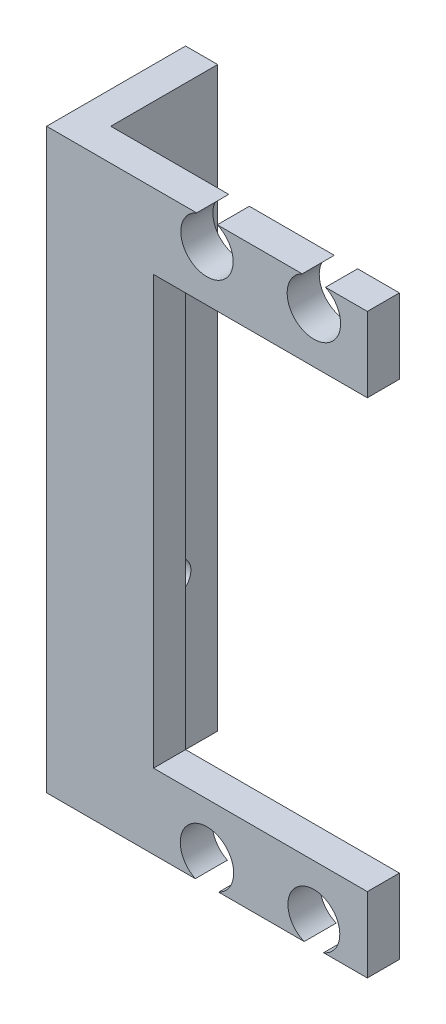
ISO-10303-21;
HEADER;
FILE_DESCRIPTION(('STEP AP214'),'2;1');
FILE_NAME('part.step','',(''),(''),'','','');
FILE_SCHEMA(('AUTOMOTIVE_DESIGN { 1 0 10303 214 1 1 1 1 }'));
ENDSEC;
DATA;
#1=APPLICATION_CONTEXT('core data for automotive mechanical design processes');
#2=APPLICATION_PROTOCOL_DEFINITION('international standard','automotive_design',2000,#1);
#3=PRODUCT_CONTEXT('',#1,'mechanical');
#4=PRODUCT('Part','Part','',(#3));
#5=PRODUCT_RELATED_PRODUCT_CATEGORY('part','',(#4));
#6=PRODUCT_DEFINITION_FORMATION('','',#4);
#7=PRODUCT_DEFINITION_CONTEXT('part definition',#1,'design');
#8=PRODUCT_DEFINITION('design','',#6,#7);
#9=PRODUCT_DEFINITION_SHAPE('','',#8);
#10=(LENGTH_UNIT() NAMED_UNIT(*) SI_UNIT(.MILLI.,.METRE.));
#11=(NAMED_UNIT(*) PLANE_ANGLE_UNIT() SI_UNIT($,.RADIAN.));
#12=(NAMED_UNIT(*) SI_UNIT($,.STERADIAN.) SOLID_ANGLE_UNIT());
#13=UNCERTAINTY_MEASURE_WITH_UNIT(LENGTH_MEASURE(1.E-05),#10,'distance_accuracy_value','');
#14=(GEOMETRIC_REPRESENTATION_CONTEXT(3) GLOBAL_UNCERTAINTY_ASSIGNED_CONTEXT((#13)) GLOBAL_UNIT_ASSIGNED_CONTEXT((#10,
#11,#12)) REPRESENTATION_CONTEXT('',''));
#15=CARTESIAN_POINT('',(0.,0.,0.));
#16=DIRECTION('',(0.,0.,1.));
#17=DIRECTION('',(1.,0.,0.));
#18=AXIS2_PLACEMENT_3D('',#15,#16,#17);
#19=CARTESIAN_POINT('',(3.,0.,13.));
#20=DIRECTION('',(0.,1.,0.));
#21=DIRECTION('',(0.,0.,1.));
#22=AXIS2_PLACEMENT_3D('',#19,#20,#21);
#23=PLANE('',#22);
#24=DIRECTION('',(1.,0.,0.));
#25=VECTOR('',#24,1.);
#26=CARTESIAN_POINT('',(3.,0.,13.));
#27=LINE('',#26,#25);
#28=CARTESIAN_POINT('',(25.9043671376496,0.,13.));
#29=VERTEX_POINT('',#28);
#30=CARTESIAN_POINT('',(30.,0.,13.));
#31=VERTEX_POINT('',#30);
#32=EDGE_CURVE('E202',#29,#31,#27,.T.);
#33=ORIENTED_EDGE('',*,*,#32,.F.);
#34=DIRECTION('',(0.,0.,-1.));
#35=VECTOR('',#34,1.);
#36=CARTESIAN_POINT('',(25.9043671376496,0.,13.));
#37=LINE('',#36,#35);
#38=CARTESIAN_POINT('',(25.9043671376496,0.,9.99999999999999));
#39=VERTEX_POINT('',#38);
#40=EDGE_CURVE('E504',#29,#39,#37,.T.);
#41=ORIENTED_EDGE('',*,*,#40,.T.);
#42=DIRECTION('',(-1.,0.,0.));
#43=VECTOR('',#42,1.);
#44=CARTESIAN_POINT('',(30.,0.,9.99999999999999));
#45=LINE('',#44,#43);
#46=CARTESIAN_POINT('',(30.,0.,9.99999999999999));
#47=VERTEX_POINT('',#46);
#48=EDGE_CURVE('E256',#47,#39,#45,.T.);
#49=ORIENTED_EDGE('',*,*,#48,.F.);
#50=DIRECTION('',(0.,0.,-1.));
#51=VECTOR('',#50,1.);
#52=CARTESIAN_POINT('',(30.,0.,9.99999999999999));
#53=LINE('',#52,#51);
#54=EDGE_CURVE('E545',#31,#47,#53,.T.);
#55=ORIENTED_EDGE('',*,*,#54,.F.);
#56=EDGE_LOOP('',(#33,#41,#49,#55));
#57=FACE_BOUND('',#56,.T.);
#58=ADVANCED_FACE('F41',(#57),#23,.F.);
#59=CARTESIAN_POINT('',(24.0956328623504,0.,9.99999999999999));
#60=VERTEX_POINT('',#59);
#61=CARTESIAN_POINT('',(16.0897247358847,0.,9.99999999999999));
#62=VERTEX_POINT('',#61);
#63=EDGE_CURVE('E247',#60,#62,#45,.T.);
#64=ORIENTED_EDGE('',*,*,#63,.F.);
#65=DIRECTION('',(0.,0.,-1.));
#66=VECTOR('',#65,1.);
#67=CARTESIAN_POINT('',(24.0956328623504,0.,13.));
#68=LINE('',#67,#66);
#69=CARTESIAN_POINT('',(24.0956328623504,0.,13.));
#70=VERTEX_POINT('',#69);
#71=EDGE_CURVE('E502',#60,#70,#68,.F.);
#72=ORIENTED_EDGE('',*,*,#71,.T.);
#73=CARTESIAN_POINT('',(16.0897247358847,0.,13.));
#74=VERTEX_POINT('',#73);
#75=EDGE_CURVE('E201',#74,#70,#27,.T.);
#76=ORIENTED_EDGE('',*,*,#75,.F.);
#77=DIRECTION('',(0.,0.,-1.));
#78=VECTOR('',#77,1.);
#79=CARTESIAN_POINT('',(16.0897247358847,0.,13.));
#80=LINE('',#79,#78);
#81=EDGE_CURVE('E519',#74,#62,#80,.T.);
#82=ORIENTED_EDGE('',*,*,#81,.T.);
#83=EDGE_LOOP('',(#64,#72,#76,#82));
#84=FACE_BOUND('',#83,.T.);
#85=ADVANCED_FACE('F305',(#84),#23,.F.);
#86=CARTESIAN_POINT('',(0.,54.,13.));
#87=DIRECTION('',(0.,-1.,0.));
#88=DIRECTION('',(0.,0.,-1.));
#89=AXIS2_PLACEMENT_3D('',#86,#87,#88);
#90=PLANE('',#89);
#91=DIRECTION('',(-1.,0.,0.));
#92=VECTOR('',#91,1.);
#93=CARTESIAN_POINT('',(0.,54.,13.));
#94=LINE('',#93,#92);
#95=CARTESIAN_POINT('',(14.0365036760482,54.,13.));
#96=VERTEX_POINT('',#95);
#97=CARTESIAN_POINT('',(0.,54.,13.));
#98=VERTEX_POINT('',#97);
#99=EDGE_CURVE('E192',#96,#98,#94,.T.);
#100=ORIENTED_EDGE('',*,*,#99,.F.);
#101=DIRECTION('',(0.,0.,-1.));
#102=VECTOR('',#101,1.);
#103=CARTESIAN_POINT('',(14.0365036760482,54.,13.));
#104=LINE('',#103,#102);
#105=CARTESIAN_POINT('',(14.0365036760482,54.,10.));
#106=VERTEX_POINT('',#105);
#107=EDGE_CURVE('E508',#96,#106,#104,.T.);
#108=ORIENTED_EDGE('',*,*,#107,.T.);
#109=DIRECTION('',(-1.,0.,0.));
#110=VECTOR('',#109,1.);
#111=CARTESIAN_POINT('',(30.,54.,10.));
#112=LINE('',#111,#110);
#113=CARTESIAN_POINT('',(3.,54.,10.));
#114=VERTEX_POINT('',#113);
#115=EDGE_CURVE('E259',#106,#114,#112,.T.);
#116=ORIENTED_EDGE('',*,*,#115,.T.);
#117=DIRECTION('',(0.,0.,-1.));
#118=VECTOR('',#117,1.);
#119=CARTESIAN_POINT('',(3.,54.,13.));
#120=LINE('',#119,#118);
#121=CARTESIAN_POINT('',(3.,54.,0.));
#122=VERTEX_POINT('',#121);
#123=EDGE_CURVE('E225',#114,#122,#120,.T.);
#124=ORIENTED_EDGE('',*,*,#123,.T.);
#125=DIRECTION('',(-1.,0.,0.));
#126=VECTOR('',#125,1.);
#127=CARTESIAN_POINT('',(0.,54.,0.));
#128=LINE('',#127,#126);
#129=CARTESIAN_POINT('',(0.,54.,0.));
#130=VERTEX_POINT('',#129);
#131=EDGE_CURVE('E211',#122,#130,#128,.T.);
#132=ORIENTED_EDGE('',*,*,#131,.T.);
#133=DIRECTION('',(0.,0.,-1.));
#134=VECTOR('',#133,1.);
#135=CARTESIAN_POINT('',(0.,54.,13.));
#136=LINE('',#135,#134);
#137=EDGE_CURVE('E223',#98,#130,#136,.T.);
#138=ORIENTED_EDGE('',*,*,#137,.F.);
#139=EDGE_LOOP('',(#100,#108,#116,#124,#132,#138));
#140=FACE_BOUND('',#139,.T.);
#141=ADVANCED_FACE('F289',(#140),#90,.F.);
#142=CARTESIAN_POINT('',(23.9102752641151,54.,10.));
#143=VERTEX_POINT('',#142);
#144=CARTESIAN_POINT('',(15.9634963239525,54.,10.));
#145=VERTEX_POINT('',#144);
#146=EDGE_CURVE('E257',#143,#145,#112,.T.);
#147=ORIENTED_EDGE('',*,*,#146,.T.);
#148=DIRECTION('',(0.,0.,-1.));
#149=VECTOR('',#148,1.);
#150=CARTESIAN_POINT('',(15.9634963239525,54.,13.));
#151=LINE('',#150,#149);
#152=CARTESIAN_POINT('',(15.9634963239525,54.,13.));
#153=VERTEX_POINT('',#152);
#154=EDGE_CURVE('E56',#145,#153,#151,.F.);
#155=ORIENTED_EDGE('',*,*,#154,.T.);
#156=CARTESIAN_POINT('',(23.9102752641151,54.,13.));
#157=VERTEX_POINT('',#156);
#158=EDGE_CURVE('E190',#157,#153,#94,.T.);
#159=ORIENTED_EDGE('',*,*,#158,.F.);
#160=DIRECTION('',(0.,0.,-1.));
#161=VECTOR('',#160,1.);
#162=CARTESIAN_POINT('',(23.9102752641151,54.,13.));
#163=LINE('',#162,#161);
#164=EDGE_CURVE('E167',#157,#143,#163,.T.);
#165=ORIENTED_EDGE('',*,*,#164,.T.);
#166=EDGE_LOOP('',(#147,#155,#159,#165));
#167=FACE_BOUND('',#166,.T.);
#168=ADVANCED_FACE('F302',(#167),#90,.F.);
#169=CARTESIAN_POINT('',(30.,0.,0.));
#170=DIRECTION('',(-1.,0.,0.));
#171=DIRECTION('',(0.,0.,1.));
#172=AXIS2_PLACEMENT_3D('',#169,#170,#171);
#173=PLANE('',#172);
#174=DIRECTION('',(0.,1.,0.));
#175=VECTOR('',#174,1.);
#176=CARTESIAN_POINT('',(30.,54.,10.));
#177=LINE('',#176,#175);
#178=CARTESIAN_POINT('',(30.,7.00000000000003,9.99999999999999));
#179=VERTEX_POINT('',#178);
#180=EDGE_CURVE('E549',#47,#179,#177,.T.);
#181=ORIENTED_EDGE('',*,*,#180,.T.);
#182=DIRECTION('',(0.,0.,1.));
#183=VECTOR('',#182,1.);
#184=CARTESIAN_POINT('',(30.,7.00000000000003,0.));
#185=LINE('',#184,#183);
#186=CARTESIAN_POINT('',(30.,7.00000000000003,13.));
#187=VERTEX_POINT('',#186);
#188=EDGE_CURVE('E232',#179,#187,#185,.T.);
#189=ORIENTED_EDGE('',*,*,#188,.T.);
#190=DIRECTION('',(0.,-1.,0.));
#191=VECTOR('',#190,1.);
#192=CARTESIAN_POINT('',(30.,0.,13.));
#193=LINE('',#192,#191);
#194=EDGE_CURVE('E546',#187,#31,#193,.T.);
#195=ORIENTED_EDGE('',*,*,#194,.T.);
#196=ORIENTED_EDGE('',*,*,#54,.T.);
#197=EDGE_LOOP('',(#181,#189,#195,#196));
#198=FACE_BOUND('',#197,.T.);
#199=ADVANCED_FACE('F317',(#198),#173,.F.);
#200=CARTESIAN_POINT('',(3.,54.,13.));
#201=DIRECTION('',(-1.,0.,0.));
#202=DIRECTION('',(0.,0.,1.));
#203=AXIS2_PLACEMENT_3D('',#200,#201,#202);
#204=PLANE('',#203);
#205=CARTESIAN_POINT('',(3.,14.3,4.));
#206=DIRECTION('',(1.,0.,0.));
#207=DIRECTION('',(0.,0.,-1.));
#208=AXIS2_PLACEMENT_3D('',#205,#206,#207);
#209=CIRCLE('',#208,1.5);
#210=CARTESIAN_POINT('',(3.,14.3,2.5));
#211=VERTEX_POINT('',#210);
#212=EDGE_CURVE('E265',#211,#211,#209,.T.);
#213=ORIENTED_EDGE('',*,*,#212,.F.);
#214=EDGE_LOOP('',(#213));
#215=FACE_BOUND('',#214,.T.);
#216=CARTESIAN_POINT('',(3.,40.5,4.));
#217=DIRECTION('',(1.,0.,0.));
#218=DIRECTION('',(0.,0.,-1.));
#219=AXIS2_PLACEMENT_3D('',#216,#217,#218);
#220=CIRCLE('',#219,1.5);
#221=CARTESIAN_POINT('',(3.,40.5,2.5));
#222=VERTEX_POINT('',#221);
#223=EDGE_CURVE('E269',#222,#222,#220,.T.);
#224=ORIENTED_EDGE('',*,*,#223,.F.);
#225=EDGE_LOOP('',(#224));
#226=FACE_BOUND('',#225,.T.);
#227=DIRECTION('',(0.,1.,0.));
#228=VECTOR('',#227,1.);
#229=CARTESIAN_POINT('',(3.,54.,10.));
#230=LINE('',#229,#228);
#231=CARTESIAN_POINT('',(3.,0.,9.99999999999999));
#232=VERTEX_POINT('',#231);
#233=EDGE_CURVE('E543',#232,#114,#230,.T.);
#234=ORIENTED_EDGE('',*,*,#233,.F.);
#235=DIRECTION('',(0.,0.,-1.));
#236=VECTOR('',#235,1.);
#237=CARTESIAN_POINT('',(3.,0.,13.));
#238=LINE('',#237,#236);
#239=CARTESIAN_POINT('',(3.,0.,0.));
#240=VERTEX_POINT('',#239);
#241=EDGE_CURVE('E227',#232,#240,#238,.T.);
#242=ORIENTED_EDGE('',*,*,#241,.T.);
#243=DIRECTION('',(0.,1.,0.));
#244=VECTOR('',#243,1.);
#245=CARTESIAN_POINT('',(3.,54.,0.));
#246=LINE('',#245,#244);
#247=EDGE_CURVE('E218',#240,#122,#246,.T.);
#248=ORIENTED_EDGE('',*,*,#247,.T.);
#249=ORIENTED_EDGE('',*,*,#123,.F.);
#250=EDGE_LOOP('',(#234,#242,#248,#249));
#251=FACE_BOUND('',#250,.T.);
#252=ADVANCED_FACE('F285',(#215,#226,#251),#204,.F.);
#253=CARTESIAN_POINT('',(13.9102752641155,0.,9.99999999999999));
#254=VERTEX_POINT('',#253);
#255=EDGE_CURVE('E244',#254,#232,#45,.T.);
#256=ORIENTED_EDGE('',*,*,#255,.F.);
#257=DIRECTION('',(0.,0.,-1.));
#258=VECTOR('',#257,1.);
#259=CARTESIAN_POINT('',(13.9102752641155,0.,13.));
#260=LINE('',#259,#258);
#261=CARTESIAN_POINT('',(13.9102752641155,0.,13.));
#262=VERTEX_POINT('',#261);
#263=EDGE_CURVE('E253',#254,#262,#260,.F.);
#264=ORIENTED_EDGE('',*,*,#263,.T.);
#265=CARTESIAN_POINT('',(0.,0.,13.));
#266=VERTEX_POINT('',#265);
#267=EDGE_CURVE('E196',#266,#262,#27,.T.);
#268=ORIENTED_EDGE('',*,*,#267,.F.);
#269=DIRECTION('',(0.,0.,-1.));
#270=VECTOR('',#269,1.);
#271=CARTESIAN_POINT('',(0.,0.,13.));
#272=LINE('',#271,#270);
#273=CARTESIAN_POINT('',(0.,0.,0.));
#274=VERTEX_POINT('',#273);
#275=EDGE_CURVE('E193',#266,#274,#272,.T.);
#276=ORIENTED_EDGE('',*,*,#275,.T.);
#277=DIRECTION('',(1.,0.,0.));
#278=VECTOR('',#277,1.);
#279=CARTESIAN_POINT('',(3.,0.,0.));
#280=LINE('',#279,#278);
#281=EDGE_CURVE('E275',#274,#240,#280,.T.);
#282=ORIENTED_EDGE('',*,*,#281,.T.);
#283=ORIENTED_EDGE('',*,*,#241,.F.);
#284=EDGE_LOOP('',(#256,#264,#268,#276,#282,#283));
#285=FACE_BOUND('',#284,.T.);
#286=ADVANCED_FACE('F43',(#285),#23,.F.);
#287=CARTESIAN_POINT('',(30.,54.,10.));
#288=VERTEX_POINT('',#287);
#289=CARTESIAN_POINT('',(26.0897247358856,54.,10.));
#290=VERTEX_POINT('',#289);
#291=EDGE_CURVE('E181',#288,#290,#112,.T.);
#292=ORIENTED_EDGE('',*,*,#291,.T.);
#293=DIRECTION('',(0.,0.,-1.));
#294=VECTOR('',#293,1.);
#295=CARTESIAN_POINT('',(26.0897247358856,54.,13.));
#296=LINE('',#295,#294);
#297=CARTESIAN_POINT('',(26.0897247358856,54.,13.));
#298=VERTEX_POINT('',#297);
#299=EDGE_CURVE('E64',#290,#298,#296,.F.);
#300=ORIENTED_EDGE('',*,*,#299,.T.);
#301=CARTESIAN_POINT('',(30.,54.,13.));
#302=VERTEX_POINT('',#301);
#303=EDGE_CURVE('E178',#302,#298,#94,.T.);
#304=ORIENTED_EDGE('',*,*,#303,.F.);
#305=DIRECTION('',(0.,0.,1.));
#306=VECTOR('',#305,1.);
#307=CARTESIAN_POINT('',(30.,54.,13.));
#308=LINE('',#307,#306);
#309=EDGE_CURVE('E552',#288,#302,#308,.T.);
#310=ORIENTED_EDGE('',*,*,#309,.F.);
#311=EDGE_LOOP('',(#292,#300,#304,#310));
#312=FACE_BOUND('',#311,.T.);
#313=ADVANCED_FACE('F176',(#312),#90,.F.);
#314=CARTESIAN_POINT('',(0.,0.,13.));
#315=DIRECTION('',(1.,0.,0.));
#316=DIRECTION('',(0.,0.,-1.));
#317=AXIS2_PLACEMENT_3D('',#314,#315,#316);
#318=PLANE('',#317);
#319=CARTESIAN_POINT('',(0.,40.5,4.));
#320=DIRECTION('',(1.,0.,0.));
#321=DIRECTION('',(0.,0.,-1.));
#322=AXIS2_PLACEMENT_3D('',#319,#320,#321);
#323=CIRCLE('',#322,1.5);
#324=CARTESIAN_POINT('',(0.,40.5,2.5));
#325=VERTEX_POINT('',#324);
#326=EDGE_CURVE('E273',#325,#325,#323,.T.);
#327=ORIENTED_EDGE('',*,*,#326,.T.);
#328=EDGE_LOOP('',(#327));
#329=FACE_BOUND('',#328,.T.);
#330=CARTESIAN_POINT('',(0.,14.3,4.));
#331=DIRECTION('',(1.,0.,0.));
#332=DIRECTION('',(0.,0.,-1.));
#333=AXIS2_PLACEMENT_3D('',#330,#331,#332);
#334=CIRCLE('',#333,1.5);
#335=CARTESIAN_POINT('',(0.,14.3,2.5));
#336=VERTEX_POINT('',#335);
#337=EDGE_CURVE('E261',#336,#336,#334,.T.);
#338=ORIENTED_EDGE('',*,*,#337,.T.);
#339=EDGE_LOOP('',(#338));
#340=FACE_BOUND('',#339,.T.);
#341=DIRECTION('',(0.,-1.,0.));
#342=VECTOR('',#341,1.);
#343=CARTESIAN_POINT('',(0.,0.,0.));
#344=LINE('',#343,#342);
#345=EDGE_CURVE('E206',#130,#274,#344,.T.);
#346=ORIENTED_EDGE('',*,*,#345,.T.);
#347=ORIENTED_EDGE('',*,*,#275,.F.);
#348=DIRECTION('',(0.,-1.,0.));
#349=VECTOR('',#348,1.);
#350=CARTESIAN_POINT('',(0.,0.,13.));
#351=LINE('',#350,#349);
#352=EDGE_CURVE('E189',#98,#266,#351,.T.);
#353=ORIENTED_EDGE('',*,*,#352,.F.);
#354=ORIENTED_EDGE('',*,*,#137,.T.);
#355=EDGE_LOOP('',(#346,#347,#353,#354));
#356=FACE_BOUND('',#355,.T.);
#357=ADVANCED_FACE('F291',(#329,#340,#356),#318,.F.);
#358=CARTESIAN_POINT('',(0.,0.,13.));
#359=DIRECTION('',(0.,0.,-1.));
#360=DIRECTION('',(-1.,0.,0.));
#361=AXIS2_PLACEMENT_3D('',#358,#359,#360);
#362=PLANE('',#361);
#363=ORIENTED_EDGE('',*,*,#75,.T.);
#364=CARTESIAN_POINT('',(25.,2.25000000000001,13.));
#365=DIRECTION('',(0.,0.,-1.));
#366=DIRECTION('',(0.,1.,0.));
#367=AXIS2_PLACEMENT_3D('',#364,#365,#366);
#368=CIRCLE('',#367,2.42494946744474);
#369=EDGE_CURVE('E500',#70,#29,#368,.T.);
#370=ORIENTED_EDGE('',*,*,#369,.T.);
#371=ORIENTED_EDGE('',*,*,#32,.T.);
#372=ORIENTED_EDGE('',*,*,#194,.F.);
#373=DIRECTION('',(1.,0.,0.));
#374=VECTOR('',#373,1.);
#375=CARTESIAN_POINT('',(10.,7.00000000000003,13.));
#376=LINE('',#375,#374);
#377=CARTESIAN_POINT('',(10.,7.00000000000003,13.));
#378=VERTEX_POINT('',#377);
#379=EDGE_CURVE('E531',#378,#187,#376,.T.);
#380=ORIENTED_EDGE('',*,*,#379,.F.);
#381=DIRECTION('',(0.,-1.,0.));
#382=VECTOR('',#381,1.);
#383=CARTESIAN_POINT('',(10.,47.,13.));
#384=LINE('',#383,#382);
#385=CARTESIAN_POINT('',(10.,47.,13.));
#386=VERTEX_POINT('',#385);
#387=EDGE_CURVE('E528',#386,#378,#384,.T.);
#388=ORIENTED_EDGE('',*,*,#387,.F.);
#389=DIRECTION('',(-1.,0.,0.));
#390=VECTOR('',#389,1.);
#391=CARTESIAN_POINT('',(30.,47.,13.));
#392=LINE('',#391,#390);
#393=CARTESIAN_POINT('',(30.,47.,13.));
#394=VERTEX_POINT('',#393);
#395=EDGE_CURVE('E525',#394,#386,#392,.T.);
#396=ORIENTED_EDGE('',*,*,#395,.F.);
#397=EDGE_CURVE('E188',#302,#394,#193,.T.);
#398=ORIENTED_EDGE('',*,*,#397,.F.);
#399=ORIENTED_EDGE('',*,*,#303,.T.);
#400=CARTESIAN_POINT('',(25.0000000000003,51.75,13.));
#401=DIRECTION('',(0.,0.,-1.));
#402=DIRECTION('',(0.,1.,0.));
#403=AXIS2_PLACEMENT_3D('',#400,#401,#402);
#404=CIRCLE('',#403,2.50000000000001);
#405=EDGE_CURVE('E164',#298,#157,#404,.T.);
#406=ORIENTED_EDGE('',*,*,#405,.T.);
#407=ORIENTED_EDGE('',*,*,#158,.T.);
#408=CARTESIAN_POINT('',(15.0000000000003,51.75,13.));
#409=DIRECTION('',(0.,0.,-1.));
#410=DIRECTION('',(0.,1.,0.));
#411=AXIS2_PLACEMENT_3D('',#408,#409,#410);
#412=CIRCLE('',#411,2.44761622119751);
#413=EDGE_CURVE('E511',#153,#96,#412,.T.);
#414=ORIENTED_EDGE('',*,*,#413,.T.);
#415=ORIENTED_EDGE('',*,*,#99,.T.);
#416=ORIENTED_EDGE('',*,*,#352,.T.);
#417=ORIENTED_EDGE('',*,*,#267,.T.);
#418=CARTESIAN_POINT('',(15.0000000000001,2.25000000000004,13.));
#419=DIRECTION('',(0.,0.,-1.));
#420=DIRECTION('',(0.,1.,0.));
#421=AXIS2_PLACEMENT_3D('',#418,#419,#420);
#422=CIRCLE('',#421,2.49999999999979);
#423=EDGE_CURVE('E510',#262,#74,#422,.T.);
#424=ORIENTED_EDGE('',*,*,#423,.T.);
#425=EDGE_LOOP('',(#363,#370,#371,#372,#380,#388,#396,#398,#399,#406,#407,#414,#415,#416,#417,#424));
#426=FACE_BOUND('',#425,.T.);
#427=ADVANCED_FACE('F185',(#426),#362,.F.);
#428=CARTESIAN_POINT('',(0.,0.,0.));
#429=DIRECTION('',(0.,0.,-1.));
#430=DIRECTION('',(-1.,0.,0.));
#431=AXIS2_PLACEMENT_3D('',#428,#429,#430);
#432=PLANE('',#431);
#433=ORIENTED_EDGE('',*,*,#281,.F.);
#434=ORIENTED_EDGE('',*,*,#345,.F.);
#435=ORIENTED_EDGE('',*,*,#131,.F.);
#436=ORIENTED_EDGE('',*,*,#247,.F.);
#437=EDGE_LOOP('',(#433,#434,#435,#436));
#438=FACE_BOUND('',#437,.T.);
#439=ADVANCED_FACE('F287',(#438),#432,.T.);
#440=CARTESIAN_POINT('',(0.,14.3,4.));
#441=DIRECTION('',(1.,0.,0.));
#442=DIRECTION('',(0.,0.,-1.));
#443=AXIS2_PLACEMENT_3D('',#440,#441,#442);
#444=CYLINDRICAL_SURFACE('',#443,1.5);
#445=ORIENTED_EDGE('',*,*,#337,.F.);
#446=EDGE_LOOP('',(#445));
#447=FACE_BOUND('',#446,.T.);
#448=ORIENTED_EDGE('',*,*,#212,.T.);
#449=EDGE_LOOP('',(#448));
#450=FACE_BOUND('',#449,.T.);
#451=ADVANCED_FACE('F331',(#447,#450),#444,.F.);
#452=CARTESIAN_POINT('',(0.,40.5,4.));
#453=DIRECTION('',(1.,0.,0.));
#454=DIRECTION('',(0.,0.,-1.));
#455=AXIS2_PLACEMENT_3D('',#452,#453,#454);
#456=CYLINDRICAL_SURFACE('',#455,1.5);
#457=ORIENTED_EDGE('',*,*,#326,.F.);
#458=EDGE_LOOP('',(#457));
#459=FACE_BOUND('',#458,.T.);
#460=ORIENTED_EDGE('',*,*,#223,.T.);
#461=EDGE_LOOP('',(#460));
#462=FACE_BOUND('',#461,.T.);
#463=ADVANCED_FACE('F330',(#459,#462),#456,.F.);
#464=CARTESIAN_POINT('',(30.,54.,10.));
#465=DIRECTION('',(0.,0.,1.));
#466=DIRECTION('',(0.,-1.,0.));
#467=AXIS2_PLACEMENT_3D('',#464,#465,#466);
#468=PLANE('',#467);
#469=ORIENTED_EDGE('',*,*,#48,.T.);
#470=CARTESIAN_POINT('',(25.,2.25000000000001,9.99999999999999));
#471=DIRECTION('',(0.,0.,1.));
#472=DIRECTION('',(0.,-1.,0.));
#473=AXIS2_PLACEMENT_3D('',#470,#471,#472);
#474=CIRCLE('',#473,2.42494946744474);
#475=EDGE_CURVE('E11',#39,#60,#474,.T.);
#476=ORIENTED_EDGE('',*,*,#475,.T.);
#477=ORIENTED_EDGE('',*,*,#63,.T.);
#478=CARTESIAN_POINT('',(15.0000000000001,2.25000000000004,9.99999999999999));
#479=DIRECTION('',(0.,0.,1.));
#480=DIRECTION('',(0.,-1.,0.));
#481=AXIS2_PLACEMENT_3D('',#478,#479,#480);
#482=CIRCLE('',#481,2.49999999999979);
#483=EDGE_CURVE('E49',#62,#254,#482,.T.);
#484=ORIENTED_EDGE('',*,*,#483,.T.);
#485=ORIENTED_EDGE('',*,*,#255,.T.);
#486=ORIENTED_EDGE('',*,*,#233,.T.);
#487=ORIENTED_EDGE('',*,*,#115,.F.);
#488=CARTESIAN_POINT('',(15.0000000000003,51.75,10.));
#489=DIRECTION('',(0.,0.,-1.));
#490=DIRECTION('',(0.,1.,0.));
#491=AXIS2_PLACEMENT_3D('',#488,#489,#490);
#492=CIRCLE('',#491,2.44761622119751);
#493=EDGE_CURVE('E505',#145,#106,#492,.T.);
#494=ORIENTED_EDGE('',*,*,#493,.F.);
#495=ORIENTED_EDGE('',*,*,#146,.F.);
#496=CARTESIAN_POINT('',(25.0000000000003,51.75,10.));
#497=DIRECTION('',(0.,0.,-1.));
#498=DIRECTION('',(0.,1.,0.));
#499=AXIS2_PLACEMENT_3D('',#496,#497,#498);
#500=CIRCLE('',#499,2.50000000000001);
#501=EDGE_CURVE('E172',#290,#143,#500,.T.);
#502=ORIENTED_EDGE('',*,*,#501,.F.);
#503=ORIENTED_EDGE('',*,*,#291,.F.);
#504=CARTESIAN_POINT('',(30.,47.,10.));
#505=VERTEX_POINT('',#504);
#506=EDGE_CURVE('E548',#505,#288,#177,.T.);
#507=ORIENTED_EDGE('',*,*,#506,.F.);
#508=DIRECTION('',(-1.,0.,0.));
#509=VECTOR('',#508,1.);
#510=CARTESIAN_POINT('',(30.,47.,10.));
#511=LINE('',#510,#509);
#512=CARTESIAN_POINT('',(10.,47.,9.99999999999999));
#513=VERTEX_POINT('',#512);
#514=EDGE_CURVE('E536',#505,#513,#511,.T.);
#515=ORIENTED_EDGE('',*,*,#514,.T.);
#516=DIRECTION('',(0.,-1.,0.));
#517=VECTOR('',#516,1.);
#518=CARTESIAN_POINT('',(10.,54.,10.));
#519=LINE('',#518,#517);
#520=CARTESIAN_POINT('',(10.,7.00000000000003,9.99999999999999));
#521=VERTEX_POINT('',#520);
#522=EDGE_CURVE('E235',#513,#521,#519,.T.);
#523=ORIENTED_EDGE('',*,*,#522,.T.);
#524=DIRECTION('',(1.,0.,0.));
#525=VECTOR('',#524,1.);
#526=CARTESIAN_POINT('',(30.,7.00000000000003,9.99999999999999));
#527=LINE('',#526,#525);
#528=EDGE_CURVE('E540',#521,#179,#527,.T.);
#529=ORIENTED_EDGE('',*,*,#528,.T.);
#530=ORIENTED_EDGE('',*,*,#180,.F.);
#531=EDGE_LOOP('',(#469,#476,#477,#484,#485,#486,#487,#494,#495,#502,#503,#507,#515,#523,#529,#530));
#532=FACE_BOUND('',#531,.T.);
#533=ADVANCED_FACE('F242',(#532),#468,.F.);
#534=ORIENTED_EDGE('',*,*,#397,.T.);
#535=DIRECTION('',(0.,0.,-1.));
#536=VECTOR('',#535,1.);
#537=CARTESIAN_POINT('',(30.,47.,0.));
#538=LINE('',#537,#536);
#539=EDGE_CURVE('E229',#394,#505,#538,.T.);
#540=ORIENTED_EDGE('',*,*,#539,.T.);
#541=ORIENTED_EDGE('',*,*,#506,.T.);
#542=ORIENTED_EDGE('',*,*,#309,.T.);
#543=EDGE_LOOP('',(#534,#540,#541,#542));
#544=FACE_BOUND('',#543,.T.);
#545=ADVANCED_FACE('F325',(#544),#173,.F.);
#546=CARTESIAN_POINT('',(10.,47.,0.));
#547=DIRECTION('',(-1.,0.,0.));
#548=DIRECTION('',(0.,-1.,0.));
#549=AXIS2_PLACEMENT_3D('',#546,#547,#548);
#550=PLANE('',#549);
#551=DIRECTION('',(0.,0.,1.));
#552=VECTOR('',#551,1.);
#553=CARTESIAN_POINT('',(10.,47.,0.));
#554=LINE('',#553,#552);
#555=EDGE_CURVE('E533',#513,#386,#554,.T.);
#556=ORIENTED_EDGE('',*,*,#555,.T.);
#557=ORIENTED_EDGE('',*,*,#387,.T.);
#558=DIRECTION('',(0.,0.,1.));
#559=VECTOR('',#558,1.);
#560=CARTESIAN_POINT('',(10.,7.00000000000003,0.));
#561=LINE('',#560,#559);
#562=EDGE_CURVE('E534',#521,#378,#561,.T.);
#563=ORIENTED_EDGE('',*,*,#562,.F.);
#564=ORIENTED_EDGE('',*,*,#522,.F.);
#565=EDGE_LOOP('',(#556,#557,#563,#564));
#566=FACE_BOUND('',#565,.T.);
#567=ADVANCED_FACE('F395',(#566),#550,.F.);
#568=CARTESIAN_POINT('',(10.,7.00000000000003,0.));
#569=DIRECTION('',(0.,-1.,0.));
#570=DIRECTION('',(0.,0.,-1.));
#571=AXIS2_PLACEMENT_3D('',#568,#569,#570);
#572=PLANE('',#571);
#573=ORIENTED_EDGE('',*,*,#562,.T.);
#574=ORIENTED_EDGE('',*,*,#379,.T.);
#575=ORIENTED_EDGE('',*,*,#188,.F.);
#576=ORIENTED_EDGE('',*,*,#528,.F.);
#577=EDGE_LOOP('',(#573,#574,#575,#576));
#578=FACE_BOUND('',#577,.T.);
#579=ADVANCED_FACE('F409',(#578),#572,.F.);
#580=CARTESIAN_POINT('',(30.,47.,0.));
#581=DIRECTION('',(0.,1.,0.));
#582=DIRECTION('',(-1.,0.,0.));
#583=AXIS2_PLACEMENT_3D('',#580,#581,#582);
#584=PLANE('',#583);
#585=ORIENTED_EDGE('',*,*,#539,.F.);
#586=ORIENTED_EDGE('',*,*,#395,.T.);
#587=ORIENTED_EDGE('',*,*,#555,.F.);
#588=ORIENTED_EDGE('',*,*,#514,.F.);
#589=EDGE_LOOP('',(#585,#586,#587,#588));
#590=FACE_BOUND('',#589,.T.);
#591=ADVANCED_FACE('F419',(#590),#584,.F.);
#592=CARTESIAN_POINT('',(25.0000000000003,51.75,13.));
#593=DIRECTION('',(0.,0.,-1.));
#594=DIRECTION('',(0.,1.,0.));
#595=AXIS2_PLACEMENT_3D('',#592,#593,#594);
#596=CYLINDRICAL_SURFACE('',#595,2.50000000000001);
#597=ORIENTED_EDGE('',*,*,#405,.F.);
#598=ORIENTED_EDGE('',*,*,#299,.F.);
#599=ORIENTED_EDGE('',*,*,#501,.T.);
#600=ORIENTED_EDGE('',*,*,#164,.F.);
#601=EDGE_LOOP('',(#597,#598,#599,#600));
#602=FACE_BOUND('',#601,.T.);
#603=ADVANCED_FACE('F165',(#602),#596,.F.);
#604=CARTESIAN_POINT('',(15.0000000000001,2.25000000000004,13.));
#605=DIRECTION('',(0.,0.,-1.));
#606=DIRECTION('',(0.,1.,0.));
#607=AXIS2_PLACEMENT_3D('',#604,#605,#606);
#608=CYLINDRICAL_SURFACE('',#607,2.49999999999979);
#609=ORIENTED_EDGE('',*,*,#423,.F.);
#610=ORIENTED_EDGE('',*,*,#263,.F.);
#611=ORIENTED_EDGE('',*,*,#483,.F.);
#612=ORIENTED_EDGE('',*,*,#81,.F.);
#613=EDGE_LOOP('',(#609,#610,#611,#612));
#614=FACE_BOUND('',#613,.T.);
#615=ADVANCED_FACE('F470',(#614),#608,.F.);
#616=CARTESIAN_POINT('',(15.0000000000003,51.75,13.));
#617=DIRECTION('',(0.,0.,-1.));
#618=DIRECTION('',(0.,1.,0.));
#619=AXIS2_PLACEMENT_3D('',#616,#617,#618);
#620=CYLINDRICAL_SURFACE('',#619,2.44761622119751);
#621=ORIENTED_EDGE('',*,*,#413,.F.);
#622=ORIENTED_EDGE('',*,*,#154,.F.);
#623=ORIENTED_EDGE('',*,*,#493,.T.);
#624=ORIENTED_EDGE('',*,*,#107,.F.);
#625=EDGE_LOOP('',(#621,#622,#623,#624));
#626=FACE_BOUND('',#625,.T.);
#627=ADVANCED_FACE('F479',(#626),#620,.F.);
#628=CARTESIAN_POINT('',(25.,2.25000000000001,13.));
#629=DIRECTION('',(0.,0.,-1.));
#630=DIRECTION('',(0.,1.,0.));
#631=AXIS2_PLACEMENT_3D('',#628,#629,#630);
#632=CYLINDRICAL_SURFACE('',#631,2.42494946744474);
#633=ORIENTED_EDGE('',*,*,#369,.F.);
#634=ORIENTED_EDGE('',*,*,#71,.F.);
#635=ORIENTED_EDGE('',*,*,#475,.F.);
#636=ORIENTED_EDGE('',*,*,#40,.F.);
#637=EDGE_LOOP('',(#633,#634,#635,#636));
#638=FACE_BOUND('',#637,.T.);
#639=ADVANCED_FACE('F488',(#638),#632,.F.);
#640=CLOSED_SHELL('',(#58,#85,#141,#168,#199,#252,#286,#313,#357,#427,#439,#451,#463,#533,#545,
#567,#579,#591,#603,#615,#627,#639));
#641=MANIFOLD_SOLID_BREP('B2',#640);
#642=ADVANCED_BREP_SHAPE_REPRESENTATION('',(#18,#641),#14);
#643=SHAPE_DEFINITION_REPRESENTATION(#9,#642);
ENDSEC;
END-ISO-10303-21;
